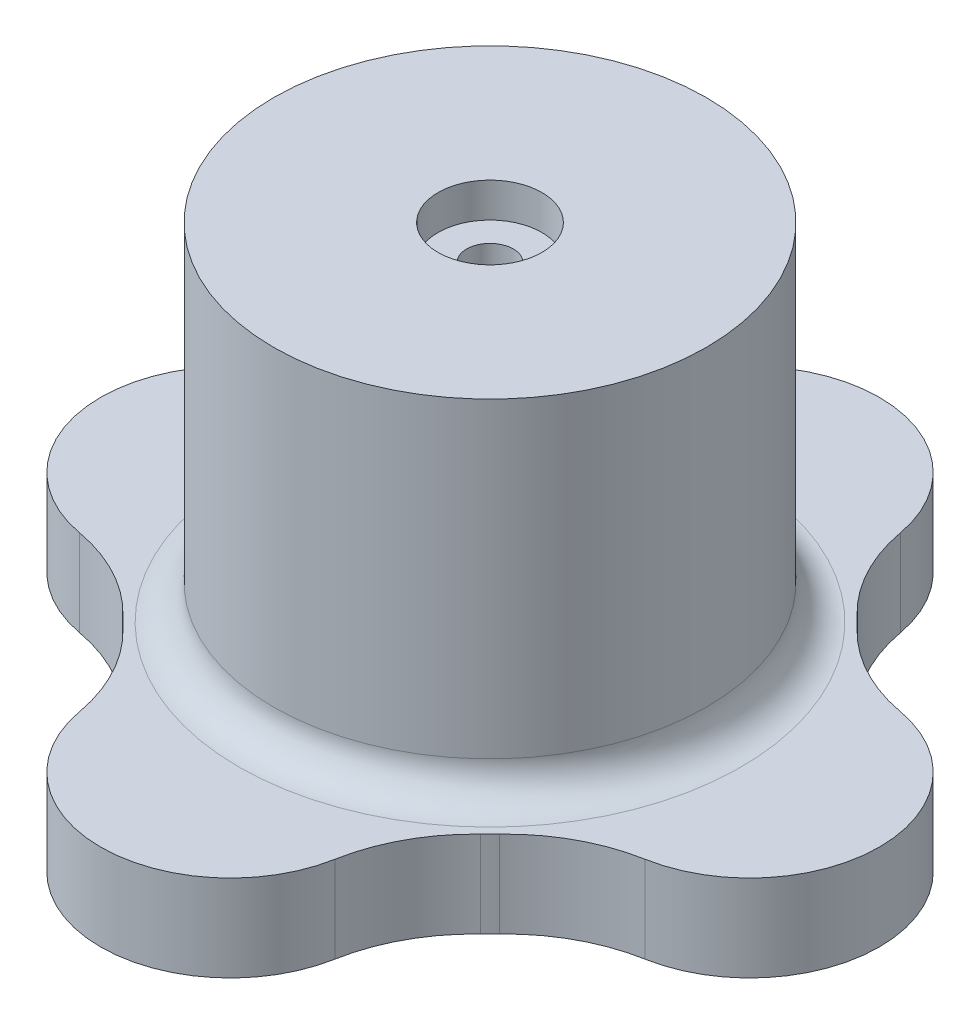
ISO-10303-21;
HEADER;
FILE_DESCRIPTION(('STEP AP214'),'2;1');
FILE_NAME('part.step','',(''),(''),'','','');
FILE_SCHEMA(('AUTOMOTIVE_DESIGN { 1 0 10303 214 1 1 1 1 }'));
ENDSEC;
DATA;
#1=APPLICATION_CONTEXT('core data for automotive mechanical design processes');
#2=APPLICATION_PROTOCOL_DEFINITION('international standard','automotive_design',2000,#1);
#3=PRODUCT_CONTEXT('',#1,'mechanical');
#4=PRODUCT('Part','Part','',(#3));
#5=PRODUCT_RELATED_PRODUCT_CATEGORY('part','',(#4));
#6=PRODUCT_DEFINITION_FORMATION('','',#4);
#7=PRODUCT_DEFINITION_CONTEXT('part definition',#1,'design');
#8=PRODUCT_DEFINITION('design','',#6,#7);
#9=PRODUCT_DEFINITION_SHAPE('','',#8);
#10=(LENGTH_UNIT() NAMED_UNIT(*) SI_UNIT(.MILLI.,.METRE.));
#11=(NAMED_UNIT(*) PLANE_ANGLE_UNIT() SI_UNIT($,.RADIAN.));
#12=(NAMED_UNIT(*) SI_UNIT($,.STERADIAN.) SOLID_ANGLE_UNIT());
#13=UNCERTAINTY_MEASURE_WITH_UNIT(LENGTH_MEASURE(1.E-05),#10,'distance_accuracy_value','');
#14=(GEOMETRIC_REPRESENTATION_CONTEXT(3) GLOBAL_UNCERTAINTY_ASSIGNED_CONTEXT((#13)) GLOBAL_UNIT_ASSIGNED_CONTEXT((#10,
#11,#12)) REPRESENTATION_CONTEXT('',''));
#15=CARTESIAN_POINT('',(0.,0.,0.));
#16=DIRECTION('',(0.,0.,1.));
#17=DIRECTION('',(1.,0.,0.));
#18=AXIS2_PLACEMENT_3D('',#15,#16,#17);
#19=CARTESIAN_POINT('',(0.,5.,0.));
#20=DIRECTION('',(0.,-1.,0.));
#21=DIRECTION('',(0.,0.,-1.));
#22=AXIS2_PLACEMENT_3D('',#19,#20,#21);
#23=CYLINDRICAL_SURFACE('',#22,15.);
#24=CARTESIAN_POINT('',(0.,0.,0.));
#25=DIRECTION('',(0.,1.,0.));
#26=DIRECTION('',(0.,0.,1.));
#27=AXIS2_PLACEMENT_3D('',#24,#25,#26);
#28=CIRCLE('',#27,15.);
#29=CARTESIAN_POINT('',(-10.875,0.,10.3312329854669));
#30=VERTEX_POINT('',#29);
#31=CARTESIAN_POINT('',(-10.331232985467,0.,10.8749999999999));
#32=VERTEX_POINT('',#31);
#33=EDGE_CURVE('E360',#30,#32,#28,.T.);
#34=ORIENTED_EDGE('',*,*,#33,.T.);
#35=DIRECTION('',(0.,-1.,0.));
#36=VECTOR('',#35,1.);
#37=CARTESIAN_POINT('',(-10.3312329854671,5.,10.8749999999999));
#38=LINE('',#37,#36);
#39=CARTESIAN_POINT('',(-10.331232985467,5.,10.8749999999999));
#40=VERTEX_POINT('',#39);
#41=EDGE_CURVE('E55',#32,#40,#38,.F.);
#42=ORIENTED_EDGE('',*,*,#41,.T.);
#43=CARTESIAN_POINT('',(0.,5.,0.));
#44=DIRECTION('',(0.,1.,0.));
#45=DIRECTION('',(0.,0.,1.));
#46=AXIS2_PLACEMENT_3D('',#43,#44,#45);
#47=CIRCLE('',#46,15.);
#48=CARTESIAN_POINT('',(-10.875,5.,10.3312329854669));
#49=VERTEX_POINT('',#48);
#50=EDGE_CURVE('E200',#49,#40,#47,.T.);
#51=ORIENTED_EDGE('',*,*,#50,.F.);
#52=DIRECTION('',(0.,-1.,0.));
#53=VECTOR('',#52,1.);
#54=CARTESIAN_POINT('',(-10.875,5.,10.3312329854669));
#55=LINE('',#54,#53);
#56=EDGE_CURVE('E244',#49,#30,#55,.T.);
#57=ORIENTED_EDGE('',*,*,#56,.T.);
#58=EDGE_LOOP('',(#34,#42,#51,#57));
#59=FACE_BOUND('',#58,.T.);
#60=ADVANCED_FACE('F39',(#59),#23,.T.);
#61=CARTESIAN_POINT('',(-1.57116660247941E-13,5.,15.));
#62=DIRECTION('',(0.,-1.,0.));
#63=DIRECTION('',(0.,0.,-1.));
#64=AXIS2_PLACEMENT_3D('',#61,#62,#63);
#65=CYLINDRICAL_SURFACE('',#64,7.5);
#66=CARTESIAN_POINT('',(-1.57116660247941E-13,0.,15.));
#67=DIRECTION('',(0.,1.,0.));
#68=DIRECTION('',(0.,0.,1.));
#69=AXIS2_PLACEMENT_3D('',#66,#67,#68);
#70=CIRCLE('',#69,7.5);
#71=CARTESIAN_POINT('',(-7.37945213247655,0.,16.3392857142856));
#72=VERTEX_POINT('',#71);
#73=CARTESIAN_POINT('',(7.37945213247621,0.,16.3392857142858));
#74=VERTEX_POINT('',#73);
#75=EDGE_CURVE('E364',#72,#74,#70,.T.);
#76=ORIENTED_EDGE('',*,*,#75,.T.);
#77=DIRECTION('',(0.,-1.,0.));
#78=VECTOR('',#77,1.);
#79=CARTESIAN_POINT('',(7.37945213247621,5.,16.3392857142858));
#80=LINE('',#79,#78);
#81=CARTESIAN_POINT('',(7.37945213247621,5.,16.3392857142858));
#82=VERTEX_POINT('',#81);
#83=EDGE_CURVE('E227',#74,#82,#80,.F.);
#84=ORIENTED_EDGE('',*,*,#83,.T.);
#85=CARTESIAN_POINT('',(-1.57116660247941E-13,5.,15.));
#86=DIRECTION('',(0.,1.,0.));
#87=DIRECTION('',(0.,0.,1.));
#88=AXIS2_PLACEMENT_3D('',#85,#86,#87);
#89=CIRCLE('',#88,7.5);
#90=CARTESIAN_POINT('',(-7.37945213247655,5.,16.3392857142856));
#91=VERTEX_POINT('',#90);
#92=EDGE_CURVE('E444',#91,#82,#89,.T.);
#93=ORIENTED_EDGE('',*,*,#92,.F.);
#94=DIRECTION('',(0.,-1.,0.));
#95=VECTOR('',#94,1.);
#96=CARTESIAN_POINT('',(-7.37945213247655,5.,16.3392857142856));
#97=LINE('',#96,#95);
#98=EDGE_CURVE('E223',#91,#72,#97,.T.);
#99=ORIENTED_EDGE('',*,*,#98,.T.);
#100=EDGE_LOOP('',(#76,#84,#93,#99));
#101=FACE_BOUND('',#100,.T.);
#102=ADVANCED_FACE('F315',(#101),#65,.T.);
#103=CARTESIAN_POINT('',(0.,5.,0.));
#104=DIRECTION('',(0.,-1.,0.));
#105=DIRECTION('',(0.,0.,-1.));
#106=AXIS2_PLACEMENT_3D('',#103,#104,#105);
#107=CYLINDRICAL_SURFACE('',#106,15.);
#108=CARTESIAN_POINT('',(0.,5.,0.));
#109=DIRECTION('',(0.,1.,0.));
#110=DIRECTION('',(0.,0.,1.));
#111=AXIS2_PLACEMENT_3D('',#108,#109,#110);
#112=CIRCLE('',#111,15.);
#113=CARTESIAN_POINT('',(10.3312329854668,5.,10.8750000000001));
#114=VERTEX_POINT('',#113);
#115=CARTESIAN_POINT('',(10.8749999999999,5.,10.331232985467));
#116=VERTEX_POINT('',#115);
#117=EDGE_CURVE('E403',#114,#116,#112,.T.);
#118=ORIENTED_EDGE('',*,*,#117,.F.);
#119=DIRECTION('',(0.,-1.,0.));
#120=VECTOR('',#119,1.);
#121=CARTESIAN_POINT('',(10.3312329854668,5.,10.8750000000001));
#122=LINE('',#121,#120);
#123=CARTESIAN_POINT('',(10.3312329854668,0.,10.8750000000001));
#124=VERTEX_POINT('',#123);
#125=EDGE_CURVE('E219',#114,#124,#122,.T.);
#126=ORIENTED_EDGE('',*,*,#125,.T.);
#127=CARTESIAN_POINT('',(0.,0.,0.));
#128=DIRECTION('',(0.,1.,0.));
#129=DIRECTION('',(0.,0.,1.));
#130=AXIS2_PLACEMENT_3D('',#127,#128,#129);
#131=CIRCLE('',#130,15.);
#132=CARTESIAN_POINT('',(10.8749999999999,0.,10.331232985467));
#133=VERTEX_POINT('',#132);
#134=EDGE_CURVE('E370',#124,#133,#131,.T.);
#135=ORIENTED_EDGE('',*,*,#134,.T.);
#136=DIRECTION('',(0.,-1.,0.));
#137=VECTOR('',#136,1.);
#138=CARTESIAN_POINT('',(10.8749999999999,5.,10.331232985467));
#139=LINE('',#138,#137);
#140=EDGE_CURVE('E216',#133,#116,#139,.F.);
#141=ORIENTED_EDGE('',*,*,#140,.T.);
#142=EDGE_LOOP('',(#118,#126,#135,#141));
#143=FACE_BOUND('',#142,.T.);
#144=ADVANCED_FACE('F320',(#143),#107,.T.);
#145=CARTESIAN_POINT('',(15.,5.,1.04744440165294E-13));
#146=DIRECTION('',(0.,-1.,0.));
#147=DIRECTION('',(0.,0.,-1.));
#148=AXIS2_PLACEMENT_3D('',#145,#146,#147);
#149=CYLINDRICAL_SURFACE('',#148,7.5);
#150=CARTESIAN_POINT('',(15.,0.,1.04744440165294E-13));
#151=DIRECTION('',(0.,1.,0.));
#152=DIRECTION('',(0.,0.,1.));
#153=AXIS2_PLACEMENT_3D('',#150,#151,#152);
#154=CIRCLE('',#153,7.5);
#155=CARTESIAN_POINT('',(16.3392857142857,0.,7.3794521324765));
#156=VERTEX_POINT('',#155);
#157=CARTESIAN_POINT('',(16.3392857142858,0.,-7.37945213247627));
#158=VERTEX_POINT('',#157);
#159=EDGE_CURVE('E193',#156,#158,#154,.T.);
#160=ORIENTED_EDGE('',*,*,#159,.T.);
#161=DIRECTION('',(0.,-1.,0.));
#162=VECTOR('',#161,1.);
#163=CARTESIAN_POINT('',(16.3392857142858,5.,-7.37945213247627));
#164=LINE('',#163,#162);
#165=CARTESIAN_POINT('',(16.3392857142858,5.,-7.37945213247627));
#166=VERTEX_POINT('',#165);
#167=EDGE_CURVE('E213',#158,#166,#164,.F.);
#168=ORIENTED_EDGE('',*,*,#167,.T.);
#169=CARTESIAN_POINT('',(15.,5.,1.04744440165294E-13));
#170=DIRECTION('',(0.,1.,0.));
#171=DIRECTION('',(0.,0.,1.));
#172=AXIS2_PLACEMENT_3D('',#169,#170,#171);
#173=CIRCLE('',#172,7.5);
#174=CARTESIAN_POINT('',(16.3392857142857,5.,7.3794521324765));
#175=VERTEX_POINT('',#174);
#176=EDGE_CURVE('E394',#175,#166,#173,.T.);
#177=ORIENTED_EDGE('',*,*,#176,.F.);
#178=DIRECTION('',(0.,-1.,0.));
#179=VECTOR('',#178,1.);
#180=CARTESIAN_POINT('',(16.3392857142857,5.,7.3794521324765));
#181=LINE('',#180,#179);
#182=EDGE_CURVE('E209',#175,#156,#181,.T.);
#183=ORIENTED_EDGE('',*,*,#182,.T.);
#184=EDGE_LOOP('',(#160,#168,#177,#183));
#185=FACE_BOUND('',#184,.T.);
#186=ADVANCED_FACE('F384',(#185),#149,.T.);
#187=CARTESIAN_POINT('',(0.,5.,0.));
#188=DIRECTION('',(0.,-1.,0.));
#189=DIRECTION('',(0.,0.,-1.));
#190=AXIS2_PLACEMENT_3D('',#187,#188,#189);
#191=CYLINDRICAL_SURFACE('',#190,15.);
#192=CARTESIAN_POINT('',(0.,0.,0.));
#193=DIRECTION('',(0.,1.,0.));
#194=DIRECTION('',(0.,0.,1.));
#195=AXIS2_PLACEMENT_3D('',#192,#193,#194);
#196=CIRCLE('',#195,15.);
#197=CARTESIAN_POINT('',(10.8750000000001,0.,-10.3312329854669));
#198=VERTEX_POINT('',#197);
#199=CARTESIAN_POINT('',(10.331232985467,0.,-10.875));
#200=VERTEX_POINT('',#199);
#201=EDGE_CURVE('E186',#198,#200,#196,.T.);
#202=ORIENTED_EDGE('',*,*,#201,.T.);
#203=DIRECTION('',(0.,-1.,0.));
#204=VECTOR('',#203,1.);
#205=CARTESIAN_POINT('',(10.331232985467,5.,-10.875));
#206=LINE('',#205,#204);
#207=CARTESIAN_POINT('',(10.331232985467,5.,-10.875));
#208=VERTEX_POINT('',#207);
#209=EDGE_CURVE('E160',#200,#208,#206,.F.);
#210=ORIENTED_EDGE('',*,*,#209,.T.);
#211=CARTESIAN_POINT('',(0.,5.,0.));
#212=DIRECTION('',(0.,1.,0.));
#213=DIRECTION('',(0.,0.,1.));
#214=AXIS2_PLACEMENT_3D('',#211,#212,#213);
#215=CIRCLE('',#214,15.);
#216=CARTESIAN_POINT('',(10.8750000000001,5.,-10.3312329854669));
#217=VERTEX_POINT('',#216);
#218=EDGE_CURVE('E393',#217,#208,#215,.T.);
#219=ORIENTED_EDGE('',*,*,#218,.F.);
#220=DIRECTION('',(0.,-1.,0.));
#221=VECTOR('',#220,1.);
#222=CARTESIAN_POINT('',(10.8750000000001,5.,-10.3312329854669));
#223=LINE('',#222,#221);
#224=EDGE_CURVE('E177',#217,#198,#223,.T.);
#225=ORIENTED_EDGE('',*,*,#224,.T.);
#226=EDGE_LOOP('',(#202,#210,#219,#225));
#227=FACE_BOUND('',#226,.T.);
#228=ADVANCED_FACE('F396',(#227),#191,.T.);
#229=CARTESIAN_POINT('',(0.,5.,-15.));
#230=DIRECTION('',(0.,-1.,0.));
#231=DIRECTION('',(0.,0.,-1.));
#232=AXIS2_PLACEMENT_3D('',#229,#230,#231);
#233=CYLINDRICAL_SURFACE('',#232,7.5);
#234=CARTESIAN_POINT('',(0.,5.,-15.));
#235=DIRECTION('',(0.,1.,0.));
#236=DIRECTION('',(0.,0.,1.));
#237=AXIS2_PLACEMENT_3D('',#234,#235,#236);
#238=CIRCLE('',#237,7.5);
#239=CARTESIAN_POINT('',(7.37945213247643,5.,-16.3392857142857));
#240=VERTEX_POINT('',#239);
#241=CARTESIAN_POINT('',(-7.37945213247632,5.,-16.3392857142857));
#242=VERTEX_POINT('',#241);
#243=EDGE_CURVE('E175',#240,#242,#238,.T.);
#244=ORIENTED_EDGE('',*,*,#243,.F.);
#245=DIRECTION('',(0.,-1.,0.));
#246=VECTOR('',#245,1.);
#247=CARTESIAN_POINT('',(7.37945213247644,5.,-16.3392857142857));
#248=LINE('',#247,#246);
#249=CARTESIAN_POINT('',(7.37945213247643,0.,-16.3392857142857));
#250=VERTEX_POINT('',#249);
#251=EDGE_CURVE('E159',#240,#250,#248,.T.);
#252=ORIENTED_EDGE('',*,*,#251,.T.);
#253=CARTESIAN_POINT('',(0.,0.,-15.));
#254=DIRECTION('',(0.,1.,0.));
#255=DIRECTION('',(0.,0.,1.));
#256=AXIS2_PLACEMENT_3D('',#253,#254,#255);
#257=CIRCLE('',#256,7.5);
#258=CARTESIAN_POINT('',(-7.37945213247632,0.,-16.3392857142857));
#259=VERTEX_POINT('',#258);
#260=EDGE_CURVE('E172',#250,#259,#257,.T.);
#261=ORIENTED_EDGE('',*,*,#260,.T.);
#262=DIRECTION('',(0.,-1.,0.));
#263=VECTOR('',#262,1.);
#264=CARTESIAN_POINT('',(-7.37945213247632,5.,-16.3392857142857));
#265=LINE('',#264,#263);
#266=EDGE_CURVE('E178',#259,#242,#265,.F.);
#267=ORIENTED_EDGE('',*,*,#266,.T.);
#268=EDGE_LOOP('',(#244,#252,#261,#267));
#269=FACE_BOUND('',#268,.T.);
#270=ADVANCED_FACE('F171',(#269),#233,.T.);
#271=CARTESIAN_POINT('',(0.,5.,0.));
#272=DIRECTION('',(0.,-1.,0.));
#273=DIRECTION('',(0.,0.,-1.));
#274=AXIS2_PLACEMENT_3D('',#271,#272,#273);
#275=CYLINDRICAL_SURFACE('',#274,15.);
#276=CARTESIAN_POINT('',(0.,5.,0.));
#277=DIRECTION('',(0.,1.,0.));
#278=DIRECTION('',(0.,0.,1.));
#279=AXIS2_PLACEMENT_3D('',#276,#277,#278);
#280=CIRCLE('',#279,15.);
#281=CARTESIAN_POINT('',(-10.3312329854669,5.,-10.875));
#282=VERTEX_POINT('',#281);
#283=CARTESIAN_POINT('',(-10.875,5.,-10.3312329854669));
#284=VERTEX_POINT('',#283);
#285=EDGE_CURVE('E401',#282,#284,#280,.T.);
#286=ORIENTED_EDGE('',*,*,#285,.F.);
#287=DIRECTION('',(0.,-1.,0.));
#288=VECTOR('',#287,1.);
#289=CARTESIAN_POINT('',(-10.3312329854669,5.,-10.875));
#290=LINE('',#289,#288);
#291=CARTESIAN_POINT('',(-10.3312329854669,0.,-10.875));
#292=VERTEX_POINT('',#291);
#293=EDGE_CURVE('E233',#282,#292,#290,.T.);
#294=ORIENTED_EDGE('',*,*,#293,.T.);
#295=CARTESIAN_POINT('',(0.,0.,0.));
#296=DIRECTION('',(0.,1.,0.));
#297=DIRECTION('',(0.,0.,1.));
#298=AXIS2_PLACEMENT_3D('',#295,#296,#297);
#299=CIRCLE('',#298,15.);
#300=CARTESIAN_POINT('',(-10.875,0.,-10.3312329854669));
#301=VERTEX_POINT('',#300);
#302=EDGE_CURVE('E185',#292,#301,#299,.T.);
#303=ORIENTED_EDGE('',*,*,#302,.T.);
#304=DIRECTION('',(0.,-1.,0.));
#305=VECTOR('',#304,1.);
#306=CARTESIAN_POINT('',(-10.875,5.,-10.3312329854669));
#307=LINE('',#306,#305);
#308=EDGE_CURVE('E230',#301,#284,#307,.F.);
#309=ORIENTED_EDGE('',*,*,#308,.T.);
#310=EDGE_LOOP('',(#286,#294,#303,#309));
#311=FACE_BOUND('',#310,.T.);
#312=ADVANCED_FACE('F417',(#311),#275,.T.);
#313=CARTESIAN_POINT('',(-15.,5.,0.));
#314=DIRECTION('',(0.,-1.,0.));
#315=DIRECTION('',(0.,0.,-1.));
#316=AXIS2_PLACEMENT_3D('',#313,#314,#315);
#317=CYLINDRICAL_SURFACE('',#316,7.5);
#318=CARTESIAN_POINT('',(-15.,5.,0.));
#319=DIRECTION('',(0.,1.,0.));
#320=DIRECTION('',(0.,0.,1.));
#321=AXIS2_PLACEMENT_3D('',#318,#319,#320);
#322=CIRCLE('',#321,7.5);
#323=CARTESIAN_POINT('',(-16.3392857142857,5.,-7.37945213247638));
#324=VERTEX_POINT('',#323);
#325=CARTESIAN_POINT('',(-16.3392857142857,5.,7.37945213247638));
#326=VERTEX_POINT('',#325);
#327=EDGE_CURVE('E202',#324,#326,#322,.T.);
#328=ORIENTED_EDGE('',*,*,#327,.F.);
#329=DIRECTION('',(0.,-1.,0.));
#330=VECTOR('',#329,1.);
#331=CARTESIAN_POINT('',(-16.3392857142857,5.,-7.37945213247638));
#332=LINE('',#331,#330);
#333=CARTESIAN_POINT('',(-16.3392857142857,0.,-7.37945213247638));
#334=VERTEX_POINT('',#333);
#335=EDGE_CURVE('E240',#324,#334,#332,.T.);
#336=ORIENTED_EDGE('',*,*,#335,.T.);
#337=CARTESIAN_POINT('',(-15.,0.,0.));
#338=DIRECTION('',(0.,1.,0.));
#339=DIRECTION('',(0.,0.,1.));
#340=AXIS2_PLACEMENT_3D('',#337,#338,#339);
#341=CIRCLE('',#340,7.5);
#342=CARTESIAN_POINT('',(-16.3392857142857,0.,7.37945213247638));
#343=VERTEX_POINT('',#342);
#344=EDGE_CURVE('E191',#334,#343,#341,.T.);
#345=ORIENTED_EDGE('',*,*,#344,.T.);
#346=DIRECTION('',(0.,-1.,0.));
#347=VECTOR('',#346,1.);
#348=CARTESIAN_POINT('',(-16.3392857142857,5.,7.37945213247638));
#349=LINE('',#348,#347);
#350=EDGE_CURVE('E237',#343,#326,#349,.F.);
#351=ORIENTED_EDGE('',*,*,#350,.T.);
#352=EDGE_LOOP('',(#328,#336,#345,#351));
#353=FACE_BOUND('',#352,.T.);
#354=ADVANCED_FACE('F414',(#353),#317,.T.);
#355=CARTESIAN_POINT('',(0.,5.,7.5));
#356=DIRECTION('',(0.,1.,0.));
#357=DIRECTION('',(0.,0.,1.));
#358=AXIS2_PLACEMENT_3D('',#355,#356,#357);
#359=PLANE('',#358);
#360=CARTESIAN_POINT('',(0.,5.,0.));
#361=DIRECTION('',(0.,1.,0.));
#362=DIRECTION('',(0.,0.,1.));
#363=AXIS2_PLACEMENT_3D('',#360,#361,#362);
#364=CIRCLE('',#363,14.5);
#365=CARTESIAN_POINT('',(0.,5.,14.5));
#366=VERTEX_POINT('',#365);
#367=EDGE_CURVE('E11',#366,#366,#364,.F.);
#368=ORIENTED_EDGE('',*,*,#367,.T.);
#369=EDGE_LOOP('',(#368));
#370=FACE_BOUND('',#369,.T.);
#371=ORIENTED_EDGE('',*,*,#327,.T.);
#372=CARTESIAN_POINT('',(-18.125,5.,17.2187216424449));
#373=DIRECTION('',(0.,1.,0.));
#374=DIRECTION('',(0.,0.,1.));
#375=AXIS2_PLACEMENT_3D('',#372,#373,#374);
#376=CIRCLE('',#375,10.);
#377=EDGE_CURVE('E62',#326,#49,#376,.F.);
#378=ORIENTED_EDGE('',*,*,#377,.T.);
#379=ORIENTED_EDGE('',*,*,#50,.T.);
#380=CARTESIAN_POINT('',(-17.2187216424451,5.,18.1249999999998));
#381=DIRECTION('',(0.,1.,0.));
#382=DIRECTION('',(0.,0.,1.));
#383=AXIS2_PLACEMENT_3D('',#380,#381,#382);
#384=CIRCLE('',#383,10.);
#385=EDGE_CURVE('E284',#40,#91,#384,.F.);
#386=ORIENTED_EDGE('',*,*,#385,.T.);
#387=ORIENTED_EDGE('',*,*,#92,.T.);
#388=CARTESIAN_POINT('',(17.2187216424447,5.,18.1250000000002));
#389=DIRECTION('',(0.,1.,0.));
#390=DIRECTION('',(0.,0.,1.));
#391=AXIS2_PLACEMENT_3D('',#388,#389,#390);
#392=CIRCLE('',#391,10.);
#393=EDGE_CURVE('E261',#82,#114,#392,.F.);
#394=ORIENTED_EDGE('',*,*,#393,.T.);
#395=ORIENTED_EDGE('',*,*,#117,.T.);
#396=CARTESIAN_POINT('',(18.1249999999999,5.,17.218721642445));
#397=DIRECTION('',(0.,1.,0.));
#398=DIRECTION('',(0.,0.,1.));
#399=AXIS2_PLACEMENT_3D('',#396,#397,#398);
#400=CIRCLE('',#399,10.);
#401=EDGE_CURVE('E267',#116,#175,#400,.F.);
#402=ORIENTED_EDGE('',*,*,#401,.T.);
#403=ORIENTED_EDGE('',*,*,#176,.T.);
#404=CARTESIAN_POINT('',(18.1250000000001,5.,-17.2187216424448));
#405=DIRECTION('',(0.,1.,0.));
#406=DIRECTION('',(0.,0.,1.));
#407=AXIS2_PLACEMENT_3D('',#404,#405,#406);
#408=CIRCLE('',#407,10.);
#409=EDGE_CURVE('E255',#166,#217,#408,.F.);
#410=ORIENTED_EDGE('',*,*,#409,.T.);
#411=ORIENTED_EDGE('',*,*,#218,.T.);
#412=CARTESIAN_POINT('',(17.2187216424449,5.,-18.1249999999999));
#413=DIRECTION('',(0.,1.,0.));
#414=DIRECTION('',(0.,0.,1.));
#415=AXIS2_PLACEMENT_3D('',#412,#413,#414);
#416=CIRCLE('',#415,10.);
#417=EDGE_CURVE('E166',#208,#240,#416,.F.);
#418=ORIENTED_EDGE('',*,*,#417,.T.);
#419=ORIENTED_EDGE('',*,*,#243,.T.);
#420=CARTESIAN_POINT('',(-17.2187216424448,5.,-18.1250000000001));
#421=DIRECTION('',(0.,1.,0.));
#422=DIRECTION('',(0.,0.,1.));
#423=AXIS2_PLACEMENT_3D('',#420,#421,#422);
#424=CIRCLE('',#423,10.);
#425=EDGE_CURVE('E272',#242,#282,#424,.F.);
#426=ORIENTED_EDGE('',*,*,#425,.T.);
#427=ORIENTED_EDGE('',*,*,#285,.T.);
#428=CARTESIAN_POINT('',(-18.125,5.,-17.2187216424449));
#429=DIRECTION('',(0.,1.,0.));
#430=DIRECTION('',(0.,0.,1.));
#431=AXIS2_PLACEMENT_3D('',#428,#429,#430);
#432=CIRCLE('',#431,10.);
#433=EDGE_CURVE('E278',#284,#324,#432,.F.);
#434=ORIENTED_EDGE('',*,*,#433,.T.);
#435=EDGE_LOOP('',(#371,#378,#379,#386,#387,#394,#395,#402,#403,#410,#411,#418,#419,#426,#427,#434));
#436=FACE_BOUND('',#435,.T.);
#437=ADVANCED_FACE('F392',(#370,#436),#359,.T.);
#438=CARTESIAN_POINT('',(0.,0.,7.5));
#439=DIRECTION('',(0.,1.,0.));
#440=DIRECTION('',(0.,0.,1.));
#441=AXIS2_PLACEMENT_3D('',#438,#439,#440);
#442=PLANE('',#441);
#443=ORIENTED_EDGE('',*,*,#33,.F.);
#444=CARTESIAN_POINT('',(-18.125,0.,17.2187216424449));
#445=DIRECTION('',(0.,1.,0.));
#446=DIRECTION('',(0.,0.,1.));
#447=AXIS2_PLACEMENT_3D('',#444,#445,#446);
#448=CIRCLE('',#447,10.);
#449=EDGE_CURVE('E287',#30,#343,#448,.T.);
#450=ORIENTED_EDGE('',*,*,#449,.T.);
#451=ORIENTED_EDGE('',*,*,#344,.F.);
#452=CARTESIAN_POINT('',(-18.125,0.,-17.2187216424449));
#453=DIRECTION('',(0.,1.,0.));
#454=DIRECTION('',(0.,0.,1.));
#455=AXIS2_PLACEMENT_3D('',#452,#453,#454);
#456=CIRCLE('',#455,10.);
#457=EDGE_CURVE('E275',#334,#301,#456,.T.);
#458=ORIENTED_EDGE('',*,*,#457,.T.);
#459=ORIENTED_EDGE('',*,*,#302,.F.);
#460=CARTESIAN_POINT('',(-17.2187216424448,0.,-18.1250000000001));
#461=DIRECTION('',(0.,1.,0.));
#462=DIRECTION('',(0.,0.,1.));
#463=AXIS2_PLACEMENT_3D('',#460,#461,#462);
#464=CIRCLE('',#463,10.);
#465=EDGE_CURVE('E183',#292,#259,#464,.T.);
#466=ORIENTED_EDGE('',*,*,#465,.T.);
#467=ORIENTED_EDGE('',*,*,#260,.F.);
#468=CARTESIAN_POINT('',(17.2187216424449,0.,-18.1249999999999));
#469=DIRECTION('',(0.,1.,0.));
#470=DIRECTION('',(0.,0.,1.));
#471=AXIS2_PLACEMENT_3D('',#468,#469,#470);
#472=CIRCLE('',#471,10.);
#473=EDGE_CURVE('E155',#250,#200,#472,.T.);
#474=ORIENTED_EDGE('',*,*,#473,.T.);
#475=ORIENTED_EDGE('',*,*,#201,.F.);
#476=CARTESIAN_POINT('',(18.1250000000001,0.,-17.2187216424448));
#477=DIRECTION('',(0.,1.,0.));
#478=DIRECTION('',(0.,0.,1.));
#479=AXIS2_PLACEMENT_3D('',#476,#477,#478);
#480=CIRCLE('',#479,10.);
#481=EDGE_CURVE('E252',#198,#158,#480,.T.);
#482=ORIENTED_EDGE('',*,*,#481,.T.);
#483=ORIENTED_EDGE('',*,*,#159,.F.);
#484=CARTESIAN_POINT('',(18.1249999999999,0.,17.218721642445));
#485=DIRECTION('',(0.,1.,0.));
#486=DIRECTION('',(0.,0.,1.));
#487=AXIS2_PLACEMENT_3D('',#484,#485,#486);
#488=CIRCLE('',#487,10.);
#489=EDGE_CURVE('E264',#156,#133,#488,.T.);
#490=ORIENTED_EDGE('',*,*,#489,.T.);
#491=ORIENTED_EDGE('',*,*,#134,.F.);
#492=CARTESIAN_POINT('',(17.2187216424447,0.,18.1250000000002));
#493=DIRECTION('',(0.,1.,0.));
#494=DIRECTION('',(0.,0.,1.));
#495=AXIS2_PLACEMENT_3D('',#492,#493,#494);
#496=CIRCLE('',#495,10.);
#497=EDGE_CURVE('E258',#124,#74,#496,.T.);
#498=ORIENTED_EDGE('',*,*,#497,.T.);
#499=ORIENTED_EDGE('',*,*,#75,.F.);
#500=CARTESIAN_POINT('',(-17.2187216424451,0.,18.1249999999998));
#501=DIRECTION('',(0.,1.,0.));
#502=DIRECTION('',(0.,0.,1.));
#503=AXIS2_PLACEMENT_3D('',#500,#501,#502);
#504=CIRCLE('',#503,10.);
#505=EDGE_CURVE('E281',#72,#32,#504,.T.);
#506=ORIENTED_EDGE('',*,*,#505,.T.);
#507=EDGE_LOOP('',(#443,#450,#451,#458,#459,#466,#467,#474,#475,#482,#483,#490,#491,#498,#499,#506));
#508=FACE_BOUND('',#507,.T.);
#509=ADVANCED_FACE('F181',(#508),#442,.F.);
#510=CARTESIAN_POINT('',(17.2187216424449,5.,-18.1249999999999));
#511=DIRECTION('',(0.,1.,0.));
#512=DIRECTION('',(0.,0.,1.));
#513=AXIS2_PLACEMENT_3D('',#510,#511,#512);
#514=CYLINDRICAL_SURFACE('',#513,10.);
#515=ORIENTED_EDGE('',*,*,#417,.F.);
#516=ORIENTED_EDGE('',*,*,#209,.F.);
#517=ORIENTED_EDGE('',*,*,#473,.F.);
#518=ORIENTED_EDGE('',*,*,#251,.F.);
#519=EDGE_LOOP('',(#515,#516,#517,#518));
#520=FACE_BOUND('',#519,.T.);
#521=ADVANCED_FACE('F158',(#520),#514,.F.);
#522=CARTESIAN_POINT('',(18.1250000000001,5.,-17.2187216424448));
#523=DIRECTION('',(0.,1.,0.));
#524=DIRECTION('',(0.,0.,1.));
#525=AXIS2_PLACEMENT_3D('',#522,#523,#524);
#526=CYLINDRICAL_SURFACE('',#525,10.);
#527=ORIENTED_EDGE('',*,*,#409,.F.);
#528=ORIENTED_EDGE('',*,*,#167,.F.);
#529=ORIENTED_EDGE('',*,*,#481,.F.);
#530=ORIENTED_EDGE('',*,*,#224,.F.);
#531=EDGE_LOOP('',(#527,#528,#529,#530));
#532=FACE_BOUND('',#531,.T.);
#533=ADVANCED_FACE('F327',(#532),#526,.F.);
#534=CARTESIAN_POINT('',(17.2187216424447,5.,18.1250000000002));
#535=DIRECTION('',(0.,1.,0.));
#536=DIRECTION('',(0.,0.,1.));
#537=AXIS2_PLACEMENT_3D('',#534,#535,#536);
#538=CYLINDRICAL_SURFACE('',#537,10.);
#539=ORIENTED_EDGE('',*,*,#393,.F.);
#540=ORIENTED_EDGE('',*,*,#83,.F.);
#541=ORIENTED_EDGE('',*,*,#497,.F.);
#542=ORIENTED_EDGE('',*,*,#125,.F.);
#543=EDGE_LOOP('',(#539,#540,#541,#542));
#544=FACE_BOUND('',#543,.T.);
#545=ADVANCED_FACE('F330',(#544),#538,.F.);
#546=CARTESIAN_POINT('',(18.1249999999999,5.,17.218721642445));
#547=DIRECTION('',(0.,1.,0.));
#548=DIRECTION('',(0.,0.,1.));
#549=AXIS2_PLACEMENT_3D('',#546,#547,#548);
#550=CYLINDRICAL_SURFACE('',#549,10.);
#551=ORIENTED_EDGE('',*,*,#401,.F.);
#552=ORIENTED_EDGE('',*,*,#140,.F.);
#553=ORIENTED_EDGE('',*,*,#489,.F.);
#554=ORIENTED_EDGE('',*,*,#182,.F.);
#555=EDGE_LOOP('',(#551,#552,#553,#554));
#556=FACE_BOUND('',#555,.T.);
#557=ADVANCED_FACE('F334',(#556),#550,.F.);
#558=CARTESIAN_POINT('',(-17.2187216424448,5.,-18.1250000000001));
#559=DIRECTION('',(0.,1.,0.));
#560=DIRECTION('',(0.,0.,1.));
#561=AXIS2_PLACEMENT_3D('',#558,#559,#560);
#562=CYLINDRICAL_SURFACE('',#561,10.);
#563=ORIENTED_EDGE('',*,*,#425,.F.);
#564=ORIENTED_EDGE('',*,*,#266,.F.);
#565=ORIENTED_EDGE('',*,*,#465,.F.);
#566=ORIENTED_EDGE('',*,*,#293,.F.);
#567=EDGE_LOOP('',(#563,#564,#565,#566));
#568=FACE_BOUND('',#567,.T.);
#569=ADVANCED_FACE('F338',(#568),#562,.F.);
#570=CARTESIAN_POINT('',(-18.125,5.,-17.2187216424449));
#571=DIRECTION('',(0.,1.,0.));
#572=DIRECTION('',(0.,0.,1.));
#573=AXIS2_PLACEMENT_3D('',#570,#571,#572);
#574=CYLINDRICAL_SURFACE('',#573,10.);
#575=ORIENTED_EDGE('',*,*,#433,.F.);
#576=ORIENTED_EDGE('',*,*,#308,.F.);
#577=ORIENTED_EDGE('',*,*,#457,.F.);
#578=ORIENTED_EDGE('',*,*,#335,.F.);
#579=EDGE_LOOP('',(#575,#576,#577,#578));
#580=FACE_BOUND('',#579,.T.);
#581=ADVANCED_FACE('F342',(#580),#574,.F.);
#582=CARTESIAN_POINT('',(-17.2187216424451,5.,18.1249999999998));
#583=DIRECTION('',(0.,1.,0.));
#584=DIRECTION('',(0.,0.,1.));
#585=AXIS2_PLACEMENT_3D('',#582,#583,#584);
#586=CYLINDRICAL_SURFACE('',#585,10.);
#587=ORIENTED_EDGE('',*,*,#385,.F.);
#588=ORIENTED_EDGE('',*,*,#41,.F.);
#589=ORIENTED_EDGE('',*,*,#505,.F.);
#590=ORIENTED_EDGE('',*,*,#98,.F.);
#591=EDGE_LOOP('',(#587,#588,#589,#590));
#592=FACE_BOUND('',#591,.T.);
#593=ADVANCED_FACE('F346',(#592),#586,.F.);
#594=CARTESIAN_POINT('',(-18.125,5.,17.2187216424449));
#595=DIRECTION('',(0.,1.,0.));
#596=DIRECTION('',(0.,0.,1.));
#597=AXIS2_PLACEMENT_3D('',#594,#595,#596);
#598=CYLINDRICAL_SURFACE('',#597,10.);
#599=ORIENTED_EDGE('',*,*,#377,.F.);
#600=ORIENTED_EDGE('',*,*,#350,.F.);
#601=ORIENTED_EDGE('',*,*,#449,.F.);
#602=ORIENTED_EDGE('',*,*,#56,.F.);
#603=EDGE_LOOP('',(#599,#600,#601,#602));
#604=FACE_BOUND('',#603,.T.);
#605=ADVANCED_FACE('F349',(#604),#598,.F.);
#606=CARTESIAN_POINT('',(0.,25.,0.));
#607=DIRECTION('',(0.,-1.,0.));
#608=DIRECTION('',(0.,0.,-1.));
#609=AXIS2_PLACEMENT_3D('',#606,#607,#608);
#610=CYLINDRICAL_SURFACE('',#609,12.5);
#611=CARTESIAN_POINT('',(0.,7.,0.));
#612=DIRECTION('',(0.,1.,0.));
#613=DIRECTION('',(0.,0.,1.));
#614=AXIS2_PLACEMENT_3D('',#611,#612,#613);
#615=CIRCLE('',#614,12.5);
#616=CARTESIAN_POINT('',(0.,7.,12.5));
#617=VERTEX_POINT('',#616);
#618=EDGE_CURVE('E48',#617,#617,#615,.T.);
#619=ORIENTED_EDGE('',*,*,#618,.T.);
#620=EDGE_LOOP('',(#619));
#621=FACE_BOUND('',#620,.T.);
#622=CARTESIAN_POINT('',(0.,25.,0.));
#623=DIRECTION('',(0.,1.,0.));
#624=DIRECTION('',(0.,0.,1.));
#625=AXIS2_PLACEMENT_3D('',#622,#623,#624);
#626=CIRCLE('',#625,12.5);
#627=CARTESIAN_POINT('',(0.,25.,12.5));
#628=VERTEX_POINT('',#627);
#629=EDGE_CURVE('E365',#628,#628,#626,.T.);
#630=ORIENTED_EDGE('',*,*,#629,.F.);
#631=EDGE_LOOP('',(#630));
#632=FACE_BOUND('',#631,.T.);
#633=ADVANCED_FACE('F301',(#621,#632),#610,.T.);
#634=CARTESIAN_POINT('',(0.,25.,0.));
#635=DIRECTION('',(0.,1.,0.));
#636=DIRECTION('',(0.,0.,1.));
#637=AXIS2_PLACEMENT_3D('',#634,#635,#636);
#638=PLANE('',#637);
#639=CARTESIAN_POINT('',(0.,25.,0.));
#640=DIRECTION('',(0.,1.,0.));
#641=DIRECTION('',(0.,0.,1.));
#642=AXIS2_PLACEMENT_3D('',#639,#640,#641);
#643=CIRCLE('',#642,3.);
#644=CARTESIAN_POINT('',(0.,25.,3.));
#645=VERTEX_POINT('',#644);
#646=EDGE_CURVE('E459',#645,#645,#643,.T.);
#647=ORIENTED_EDGE('',*,*,#646,.F.);
#648=EDGE_LOOP('',(#647));
#649=FACE_BOUND('',#648,.T.);
#650=ORIENTED_EDGE('',*,*,#629,.T.);
#651=EDGE_LOOP('',(#650));
#652=FACE_BOUND('',#651,.T.);
#653=ADVANCED_FACE('F356',(#649,#652),#638,.T.);
#654=CARTESIAN_POINT('',(0.,23.,0.));
#655=DIRECTION('',(0.,1.,0.));
#656=DIRECTION('',(0.,0.,1.));
#657=AXIS2_PLACEMENT_3D('',#654,#655,#656);
#658=PLANE('',#657);
#659=CARTESIAN_POINT('',(0.,23.,0.));
#660=DIRECTION('',(0.,1.,0.));
#661=DIRECTION('',(0.,0.,1.));
#662=AXIS2_PLACEMENT_3D('',#659,#660,#661);
#663=CIRCLE('',#662,3.);
#664=CARTESIAN_POINT('',(0.,23.,3.));
#665=VERTEX_POINT('',#664);
#666=EDGE_CURVE('E296',#665,#665,#663,.T.);
#667=ORIENTED_EDGE('',*,*,#666,.T.);
#668=EDGE_LOOP('',(#667));
#669=FACE_BOUND('',#668,.T.);
#670=CARTESIAN_POINT('',(0.,23.,0.));
#671=DIRECTION('',(0.,1.,0.));
#672=DIRECTION('',(0.,0.,1.));
#673=AXIS2_PLACEMENT_3D('',#670,#671,#672);
#674=CIRCLE('',#673,1.35);
#675=CARTESIAN_POINT('',(0.,23.,1.35));
#676=VERTEX_POINT('',#675);
#677=EDGE_CURVE('E292',#676,#676,#674,.F.);
#678=ORIENTED_EDGE('',*,*,#677,.T.);
#679=EDGE_LOOP('',(#678));
#680=FACE_BOUND('',#679,.T.);
#681=ADVANCED_FACE('F467',(#669,#680),#658,.T.);
#682=CARTESIAN_POINT('',(0.,23.,0.));
#683=DIRECTION('',(0.,1.,0.));
#684=DIRECTION('',(0.,0.,1.));
#685=AXIS2_PLACEMENT_3D('',#682,#683,#684);
#686=CYLINDRICAL_SURFACE('',#685,3.);
#687=ORIENTED_EDGE('',*,*,#666,.F.);
#688=EDGE_LOOP('',(#687));
#689=FACE_BOUND('',#688,.T.);
#690=ORIENTED_EDGE('',*,*,#646,.T.);
#691=EDGE_LOOP('',(#690));
#692=FACE_BOUND('',#691,.T.);
#693=ADVANCED_FACE('F470',(#689,#692),#686,.F.);
#694=CARTESIAN_POINT('',(0.,4.99999999999999,0.));
#695=DIRECTION('',(0.,1.,0.));
#696=DIRECTION('',(0.,0.,1.));
#697=AXIS2_PLACEMENT_3D('',#694,#695,#696);
#698=PLANE('',#697);
#699=CARTESIAN_POINT('',(0.,4.99999999999999,0.));
#700=DIRECTION('',(0.,1.,0.));
#701=DIRECTION('',(0.,0.,1.));
#702=AXIS2_PLACEMENT_3D('',#699,#700,#701);
#703=CIRCLE('',#702,1.35);
#704=CARTESIAN_POINT('',(0.,4.99999999999999,1.35));
#705=VERTEX_POINT('',#704);
#706=EDGE_CURVE('E295',#705,#705,#703,.T.);
#707=ORIENTED_EDGE('',*,*,#706,.T.);
#708=EDGE_LOOP('',(#707));
#709=FACE_BOUND('',#708,.T.);
#710=ADVANCED_FACE('F310',(#709),#698,.T.);
#711=CARTESIAN_POINT('',(0.,4.99999999999999,0.));
#712=DIRECTION('',(0.,1.,0.));
#713=DIRECTION('',(0.,0.,1.));
#714=AXIS2_PLACEMENT_3D('',#711,#712,#713);
#715=CYLINDRICAL_SURFACE('',#714,1.35);
#716=ORIENTED_EDGE('',*,*,#706,.F.);
#717=EDGE_LOOP('',(#716));
#718=FACE_BOUND('',#717,.T.);
#719=ORIENTED_EDGE('',*,*,#677,.F.);
#720=EDGE_LOOP('',(#719));
#721=FACE_BOUND('',#720,.T.);
#722=ADVANCED_FACE('F305',(#718,#721),#715,.F.);
#723=CARTESIAN_POINT('',(0.,7.,0.));
#724=DIRECTION('',(0.,1.,0.));
#725=DIRECTION('',(0.,0.,1.));
#726=AXIS2_PLACEMENT_3D('',#723,#724,#725);
#727=TOROIDAL_SURFACE('',#726,14.5,2.);
#728=ORIENTED_EDGE('',*,*,#367,.F.);
#729=EDGE_LOOP('',(#728));
#730=FACE_BOUND('',#729,.T.);
#731=ORIENTED_EDGE('',*,*,#618,.F.);
#732=EDGE_LOOP('',(#731));
#733=FACE_BOUND('',#732,.T.);
#734=ADVANCED_FACE('F41',(#730,#733),#727,.F.);
#735=CLOSED_SHELL('',(#60,#102,#144,#186,#228,#270,#312,#354,#437,#509,#521,#533,#545,#557,#569,
#581,#593,#605,#633,#653,#681,#693,#710,#722,#734));
#736=MANIFOLD_SOLID_BREP('B2',#735);
#737=ADVANCED_BREP_SHAPE_REPRESENTATION('',(#18,#736),#14);
#738=SHAPE_DEFINITION_REPRESENTATION(#9,#737);
ENDSEC;
END-ISO-10303-21;
